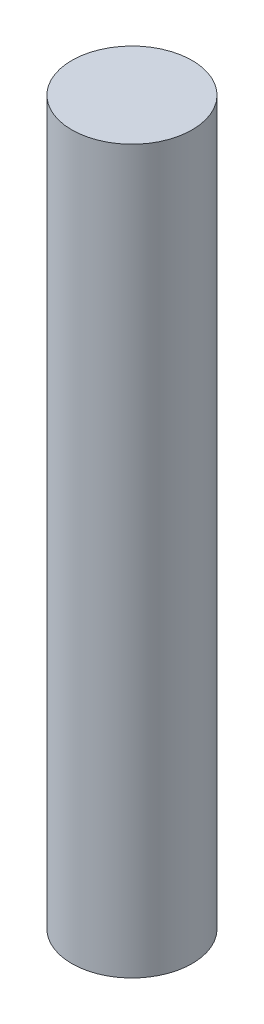
ISO-10303-21;
HEADER;
FILE_DESCRIPTION(('STEP AP214'),'2;1');
FILE_NAME('part.step','',(''),(''),'','','');
FILE_SCHEMA(('AUTOMOTIVE_DESIGN { 1 0 10303 214 1 1 1 1 }'));
ENDSEC;
DATA;
#1=APPLICATION_CONTEXT('core data for automotive mechanical design processes');
#2=APPLICATION_PROTOCOL_DEFINITION('international standard','automotive_design',2000,#1);
#3=PRODUCT_CONTEXT('',#1,'mechanical');
#4=PRODUCT('Part','Part','',(#3));
#5=PRODUCT_RELATED_PRODUCT_CATEGORY('part','',(#4));
#6=PRODUCT_DEFINITION_FORMATION('','',#4);
#7=PRODUCT_DEFINITION_CONTEXT('part definition',#1,'design');
#8=PRODUCT_DEFINITION('design','',#6,#7);
#9=PRODUCT_DEFINITION_SHAPE('','',#8);
#10=(LENGTH_UNIT() NAMED_UNIT(*) SI_UNIT(.MILLI.,.METRE.));
#11=(NAMED_UNIT(*) PLANE_ANGLE_UNIT() SI_UNIT($,.RADIAN.));
#12=(NAMED_UNIT(*) SI_UNIT($,.STERADIAN.) SOLID_ANGLE_UNIT());
#13=UNCERTAINTY_MEASURE_WITH_UNIT(LENGTH_MEASURE(1.E-05),#10,'distance_accuracy_value','');
#14=(GEOMETRIC_REPRESENTATION_CONTEXT(3) GLOBAL_UNCERTAINTY_ASSIGNED_CONTEXT((#13)) GLOBAL_UNIT_ASSIGNED_CONTEXT((#10,
#11,#12)) REPRESENTATION_CONTEXT('',''));
#15=CARTESIAN_POINT('',(0.,0.,0.));
#16=DIRECTION('',(0.,0.,1.));
#17=DIRECTION('',(1.,0.,0.));
#18=AXIS2_PLACEMENT_3D('',#15,#16,#17);
#19=CARTESIAN_POINT('',(0.,30.,0.));
#20=DIRECTION('',(0.,-1.,0.));
#21=DIRECTION('',(0.,0.,-1.));
#22=AXIS2_PLACEMENT_3D('',#19,#20,#21);
#23=CYLINDRICAL_SURFACE('',#22,2.5);
#24=CARTESIAN_POINT('',(0.,30.,0.));
#25=DIRECTION('',(0.,1.,0.));
#26=DIRECTION('',(0.,0.,1.));
#27=AXIS2_PLACEMENT_3D('',#24,#25,#26);
#28=CIRCLE('',#27,2.5);
#29=CARTESIAN_POINT('',(0.,30.,2.5));
#30=VERTEX_POINT('',#29);
#31=EDGE_CURVE('E10',#30,#30,#28,.T.);
#32=ORIENTED_EDGE('',*,*,#31,.F.);
#33=EDGE_LOOP('',(#32));
#34=FACE_BOUND('',#33,.T.);
#35=CARTESIAN_POINT('',(0.,0.,0.));
#36=DIRECTION('',(0.,1.,0.));
#37=DIRECTION('',(0.,0.,1.));
#38=AXIS2_PLACEMENT_3D('',#35,#36,#37);
#39=CIRCLE('',#38,2.5);
#40=CARTESIAN_POINT('',(0.,0.,2.5));
#41=VERTEX_POINT('',#40);
#42=EDGE_CURVE('E44',#41,#41,#39,.T.);
#43=ORIENTED_EDGE('',*,*,#42,.T.);
#44=EDGE_LOOP('',(#43));
#45=FACE_BOUND('',#44,.T.);
#46=ADVANCED_FACE('F41',(#34,#45),#23,.T.);
#47=CARTESIAN_POINT('',(0.,30.,0.));
#48=DIRECTION('',(0.,1.,0.));
#49=DIRECTION('',(0.,0.,1.));
#50=AXIS2_PLACEMENT_3D('',#47,#48,#49);
#51=PLANE('',#50);
#52=ORIENTED_EDGE('',*,*,#31,.T.);
#53=EDGE_LOOP('',(#52));
#54=FACE_BOUND('',#53,.T.);
#55=ADVANCED_FACE('F58',(#54),#51,.T.);
#56=CARTESIAN_POINT('',(0.,0.,0.));
#57=DIRECTION('',(0.,1.,0.));
#58=DIRECTION('',(0.,0.,1.));
#59=AXIS2_PLACEMENT_3D('',#56,#57,#58);
#60=PLANE('',#59);
#61=ORIENTED_EDGE('',*,*,#42,.F.);
#62=EDGE_LOOP('',(#61));
#63=FACE_BOUND('',#62,.T.);
#64=ADVANCED_FACE('F56',(#63),#60,.F.);
#65=CLOSED_SHELL('',(#46,#55,#64));
#66=MANIFOLD_SOLID_BREP('B2',#65);
#67=ADVANCED_BREP_SHAPE_REPRESENTATION('',(#18,#66),#14);
#68=SHAPE_DEFINITION_REPRESENTATION(#9,#67);
ENDSEC;
END-ISO-10303-21;
